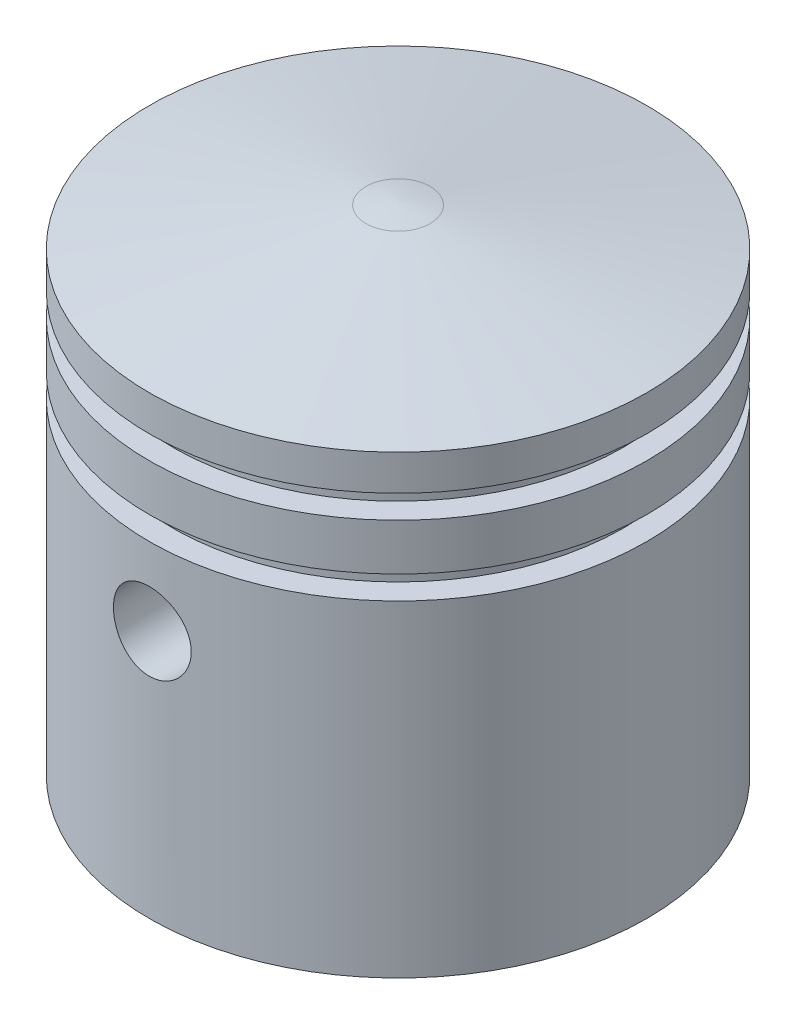
ISO-10303-21;
HEADER;
FILE_DESCRIPTION(('STEP AP214'),'2;1');
FILE_NAME('part.step','',(''),(''),'','','');
FILE_SCHEMA(('AUTOMOTIVE_DESIGN { 1 0 10303 214 1 1 1 1 }'));
ENDSEC;
DATA;
#1=APPLICATION_CONTEXT('core data for automotive mechanical design processes');
#2=APPLICATION_PROTOCOL_DEFINITION('international standard','automotive_design',2000,#1);
#3=PRODUCT_CONTEXT('',#1,'mechanical');
#4=PRODUCT('Part','Part','',(#3));
#5=PRODUCT_RELATED_PRODUCT_CATEGORY('part','',(#4));
#6=PRODUCT_DEFINITION_FORMATION('','',#4);
#7=PRODUCT_DEFINITION_CONTEXT('part definition',#1,'design');
#8=PRODUCT_DEFINITION('design','',#6,#7);
#9=PRODUCT_DEFINITION_SHAPE('','',#8);
#10=(LENGTH_UNIT() NAMED_UNIT(*) SI_UNIT(.MILLI.,.METRE.));
#11=(NAMED_UNIT(*) PLANE_ANGLE_UNIT() SI_UNIT($,.RADIAN.));
#12=(NAMED_UNIT(*) SI_UNIT($,.STERADIAN.) SOLID_ANGLE_UNIT());
#13=UNCERTAINTY_MEASURE_WITH_UNIT(LENGTH_MEASURE(1.E-05),#10,'distance_accuracy_value','');
#14=(GEOMETRIC_REPRESENTATION_CONTEXT(3) GLOBAL_UNCERTAINTY_ASSIGNED_CONTEXT((#13)) GLOBAL_UNIT_ASSIGNED_CONTEXT((#10,
#11,#12)) REPRESENTATION_CONTEXT('',''));
#15=CARTESIAN_POINT('',(0.,0.,0.));
#16=DIRECTION('',(0.,0.,1.));
#17=DIRECTION('',(1.,0.,0.));
#18=AXIS2_PLACEMENT_3D('',#15,#16,#17);
#19=CARTESIAN_POINT('',(0.,29.2889063209804,0.));
#20=DIRECTION('',(0.,-1.,0.));
#21=DIRECTION('',(1.,0.,0.));
#22=AXIS2_PLACEMENT_3D('',#19,#20,#21);
#23=CONICAL_SURFACE('',#22,16.,1.39626340159547);
#24=CARTESIAN_POINT('',(0.,31.7456109480511,0.));
#25=DIRECTION('',(0.,-1.,0.));
#26=DIRECTION('',(1.,0.,0.));
#27=AXIS2_PLACEMENT_3D('',#24,#25,#26);
#28=CIRCLE('',#27,2.06733571232229);
#29=CARTESIAN_POINT('',(2.06733571232227,31.7456109480511,0.));
#30=VERTEX_POINT('',#29);
#31=EDGE_CURVE('E62',#30,#30,#28,.T.);
#32=CARTESIAN_POINT('',(0.,29.2889063209804,0.));
#33=DIRECTION('',(0.,-1.,0.));
#34=DIRECTION('',(1.,0.,0.));
#35=AXIS2_PLACEMENT_3D('',#32,#33,#34);
#36=CIRCLE('',#35,16.);
#37=CARTESIAN_POINT('',(16.,29.2889063209804,0.));
#38=VERTEX_POINT('',#37);
#39=EDGE_CURVE('E125',#38,#38,#36,.T.);
#40=CARTESIAN_POINT('',(2.06733571232227,31.7456109480511,0.));
#41=CARTESIAN_POINT('',(2.21246763198558,31.7200202748525,0.));
#42=CARTESIAN_POINT('',(2.35759955164889,31.6944296016538,0.));
#43=CARTESIAN_POINT('',(2.64786339097551,31.6432482552565,0.));
#44=CARTESIAN_POINT('',(2.79299531063882,31.6176575820579,0.));
#45=CARTESIAN_POINT('',(3.08325914996544,31.5664762356606,0.));
#46=CARTESIAN_POINT('',(3.22839106962875,31.5408855624619,0.));
#47=CARTESIAN_POINT('',(3.51865490895537,31.4897042160646,0.));
#48=CARTESIAN_POINT('',(3.66378682861868,31.464113542866,0.));
#49=CARTESIAN_POINT('',(3.9540506679453,31.4129321964686,0.));
#50=CARTESIAN_POINT('',(4.09918258760861,31.38734152327,0.));
#51=CARTESIAN_POINT('',(4.38944642693523,31.3361601768727,0.));
#52=CARTESIAN_POINT('',(4.53457834659854,31.310569503674,0.));
#53=CARTESIAN_POINT('',(4.82484218592516,31.2593881572767,0.));
#54=CARTESIAN_POINT('',(4.96997410558847,31.2337974840781,0.));
#55=CARTESIAN_POINT('',(5.26023794491509,31.1826161376808,0.));
#56=CARTESIAN_POINT('',(5.4053698645784,31.1570254644821,0.));
#57=CARTESIAN_POINT('',(5.69563370390502,31.1058441180848,0.));
#58=CARTESIAN_POINT('',(5.84076562356833,31.0802534448861,0.));
#59=CARTESIAN_POINT('',(6.13102946289495,31.0290720984888,0.));
#60=CARTESIAN_POINT('',(6.27616138255826,31.0034814252902,0.));
#61=CARTESIAN_POINT('',(6.56642522188487,30.9523000788929,0.));
#62=CARTESIAN_POINT('',(6.71155714154818,30.9267094056942,0.));
#63=CARTESIAN_POINT('',(7.0018209808748,30.8755280592969,0.));
#64=CARTESIAN_POINT('',(7.14695290053811,30.8499373860983,0.));
#65=CARTESIAN_POINT('',(7.43721673986473,30.798756039701,0.));
#66=CARTESIAN_POINT('',(7.58234865952804,30.7731653665023,0.));
#67=CARTESIAN_POINT('',(7.87261249885466,30.721984020105,0.));
#68=CARTESIAN_POINT('',(8.01774441851797,30.6963933469063,0.));
#69=CARTESIAN_POINT('',(8.30800825784459,30.645212000509,0.));
#70=CARTESIAN_POINT('',(8.4531401775079,30.6196213273104,0.));
#71=CARTESIAN_POINT('',(8.74340401683452,30.5684399809131,0.));
#72=CARTESIAN_POINT('',(8.88853593649783,30.5428493077144,0.));
#73=CARTESIAN_POINT('',(9.17879977582445,30.4916679613171,0.));
#74=CARTESIAN_POINT('',(9.32393169548776,30.4660772881185,0.));
#75=CARTESIAN_POINT('',(9.61419553481438,30.4148959417211,0.));
#76=CARTESIAN_POINT('',(9.75932745447769,30.3893052685225,0.));
#77=CARTESIAN_POINT('',(10.0495912938043,30.3381239221252,0.));
#78=CARTESIAN_POINT('',(10.1947232134676,30.3125332489265,0.));
#79=CARTESIAN_POINT('',(10.4849870527942,30.2613519025292,0.));
#80=CARTESIAN_POINT('',(10.6301189724575,30.2357612293306,0.));
#81=CARTESIAN_POINT('',(10.9203828117842,30.1845798829333,0.));
#82=CARTESIAN_POINT('',(11.0655147314475,30.1589892097346,0.));
#83=CARTESIAN_POINT('',(11.3557785707741,30.1078078633373,0.));
#84=CARTESIAN_POINT('',(11.5009104904374,30.0822171901386,0.));
#85=CARTESIAN_POINT('',(11.791174329764,30.0310358437413,0.));
#86=CARTESIAN_POINT('',(11.9363062494273,30.0054451705427,0.));
#87=CARTESIAN_POINT('',(12.226570088754,29.9542638241454,0.));
#88=CARTESIAN_POINT('',(12.3717020084173,29.9286731509467,0.));
#89=CARTESIAN_POINT('',(12.6619658477439,29.8774918045494,0.));
#90=CARTESIAN_POINT('',(12.8070977674072,29.8519011313508,0.));
#91=CARTESIAN_POINT('',(13.0973616067338,29.8007197849535,0.));
#92=CARTESIAN_POINT('',(13.2424935263971,29.7751291117548,0.));
#93=CARTESIAN_POINT('',(13.5327573657237,29.7239477653575,0.));
#94=CARTESIAN_POINT('',(13.6778892853871,29.6983570921588,0.));
#95=CARTESIAN_POINT('',(13.9681531247137,29.6471757457615,0.));
#96=CARTESIAN_POINT('',(14.113285044377,29.6215850725629,0.));
#97=CARTESIAN_POINT('',(14.4035488837036,29.5704037261656,0.));
#98=CARTESIAN_POINT('',(14.5486808033669,29.5448130529669,0.));
#99=CARTESIAN_POINT('',(14.8389446426935,29.4936317065696,0.));
#100=CARTESIAN_POINT('',(14.9840765623568,29.468041033371,0.));
#101=CARTESIAN_POINT('',(15.2743404016835,29.4168596869736,0.));
#102=CARTESIAN_POINT('',(15.4194723213468,29.391269013775,0.));
#103=CARTESIAN_POINT('',(15.7097361606734,29.3400876673777,0.));
#104=CARTESIAN_POINT('',(15.8548680803367,29.314496994179,0.));
#105=CARTESIAN_POINT('',(16.,29.2889063209804,0.));
#106=B_SPLINE_CURVE_WITH_KNOTS('',3,(#40,#41,#42,#43,#44,#45,#46,#47,#48,#49,#50,#51,#52,#53,
#54,#55,#56,#57,#58,#59,#60,#61,#62,#63,#64,#65,#66,#67,#68,#69,#70,#71,#72,#73,#74,#75,#76,#77,
#78,#79,#80,#81,#82,#83,#84,#85,#86,#87,#88,#89,#90,#91,#92,#93,#94,#95,#96,#97,#98,#99,#100,
#101,#102,#103,#104,#105),.UNSPECIFIED.,.F.,.F.,(4,2,2,2,2,2,2,2,2,2,2,2,2,2,2,2,2,2,2,2,2,2,2,
2,2,2,2,2,2,2,2,2,4),(0.,0.442112440380564,0.88422488076113,1.3263373211417,1.76844976152226,
2.21056220190283,2.65267464228339,3.09478708266396,3.53689952304453,3.97901196342509,
4.42112440380566,4.86323684418622,5.30534928456679,5.74746172494735,6.18957416532792,
6.63168660570848,7.07379904608905,7.51591148646962,7.95802392685018,8.40013636723075,
8.84224880761131,9.28436124799188,9.72647368837244,10.168586128753,10.6106985691336,
11.0528110095141,11.4949234498947,11.9370358902753,12.3791483306558,12.8212607710364,
13.263373211417,13.7054856517975,14.1475980921781),.UNSPECIFIED.);
#107=EDGE_CURVE('BSEAM41',#30,#38,#106,.T.);
#108=ORIENTED_EDGE('',*,*,#31,.T.);
#109=ORIENTED_EDGE('',*,*,#39,.F.);
#110=ORIENTED_EDGE('',*,*,#107,.T.);
#111=ORIENTED_EDGE('',*,*,#107,.F.);
#112=EDGE_LOOP('',(#108,#110,#109,#111));
#113=FACE_BOUND('',#112,.T.);
#114=ADVANCED_FACE('F41',(#113),#23,.T.);
#115=CARTESIAN_POINT('',(-1.40562784101618,12.049455887807,0.));
#116=DIRECTION('',(0.,0.,-1.));
#117=DIRECTION('',(1.,0.,0.));
#118=AXIS2_PLACEMENT_3D('',#115,#116,#117);
#119=CIRCLE('',#118,20.);
#120=TRIMMED_CURVE('',#119,(PARAMETER_VALUE(-1.5004569469059)),
(PARAMETER_VALUE(1.5004569469059)),.T.,.PARAMETER.);
#121=CARTESIAN_POINT('',(0.,12.049455887807,0.));
#122=DIRECTION('',(0.,-1.,0.));
#123=AXIS1_PLACEMENT('',#121,#122);
#124=SURFACE_OF_REVOLUTION('',#120,#123);
#125=CARTESIAN_POINT('',(0.,32.,0.));
#126=VERTEX_POINT('',#125);
#127=VERTEX_LOOP('',#126);
#128=FACE_BOUND('',#127,.T.);
#129=ORIENTED_EDGE('',*,*,#31,.F.);
#130=EDGE_LOOP('',(#129));
#131=FACE_BOUND('',#130,.T.);
#132=ADVANCED_FACE('F56',(#128,#131),#124,.T.);
#133=CARTESIAN_POINT('',(10.,24.,0.));
#134=DIRECTION('',(0.,-1.,0.));
#135=DIRECTION('',(1.,0.,0.));
#136=AXIS2_PLACEMENT_3D('',#133,#134,#135);
#137=PLANE('',#136);
#138=CARTESIAN_POINT('',(0.,24.,0.));
#139=DIRECTION('',(0.,-1.,0.));
#140=DIRECTION('',(1.,0.,0.));
#141=AXIS2_PLACEMENT_3D('',#138,#139,#140);
#142=CIRCLE('',#141,10.);
#143=CARTESIAN_POINT('',(10.,24.,0.));
#144=VERTEX_POINT('',#143);
#145=EDGE_CURVE('E65',#144,#144,#142,.T.);
#146=ORIENTED_EDGE('',*,*,#145,.T.);
#147=EDGE_LOOP('',(#146));
#148=FACE_BOUND('',#147,.T.);
#149=ADVANCED_FACE('F59',(#148),#137,.T.);
#150=CARTESIAN_POINT('',(0.,0.,0.));
#151=DIRECTION('',(0.,-1.,0.));
#152=DIRECTION('',(1.,0.,0.));
#153=AXIS2_PLACEMENT_3D('',#150,#151,#152);
#154=CYLINDRICAL_SURFACE('',#153,10.);
#155=CARTESIAN_POINT('',(2.5,16.,-9.68245836551854));
#156=CARTESIAN_POINT('',(2.49999607859307,16.1380507509266,-9.6824610008786));
#157=CARTESIAN_POINT('',(2.48852624549765,16.2761448986785,-9.68544306014597));
#158=CARTESIAN_POINT('',(2.44302312546379,16.5483675781735,-9.69701861992564));
#159=CARTESIAN_POINT('',(2.4089767067421,16.6824937544682,-9.7056153862163));
#160=CARTESIAN_POINT('',(2.31949119963204,16.9428035381872,-9.7273872459615));
#161=CARTESIAN_POINT('',(2.26407972785449,17.0689971553857,-9.74055642690458));
#162=CARTESIAN_POINT('',(2.13352114126138,17.3103108525399,-9.76998192028759));
#163=CARTESIAN_POINT('',(2.05837318856069,17.4254304620802,-9.78623836378489));
#164=CARTESIAN_POINT('',(1.88870842731188,17.6438616452622,-9.82040716355625));
#165=CARTESIAN_POINT('',(1.79383688770405,17.74689360035,-9.83834597623034));
#166=CARTESIAN_POINT('',(1.58818206410066,17.9357613943603,-9.87362875515294));
#167=CARTESIAN_POINT('',(1.47739729418031,18.0215956256217,-9.89097266566388));
#168=CARTESIAN_POINT('',(1.24114520107896,18.1747754676313,-9.92340415520583));
#169=CARTESIAN_POINT('',(1.11549457619512,18.2418463881615,-9.93845687400593));
#170=CARTESIAN_POINT('',(0.854263184292764,18.3538096441531,-9.96430811925984));
#171=CARTESIAN_POINT('',(0.718683885791941,18.3987052519155,-9.97510727334345));
#172=CARTESIAN_POINT('',(0.444358758754161,18.4641478345786,-9.9910475884818));
#173=CARTESIAN_POINT('',(0.305732719548976,18.4851696443266,-9.99629893844314));
#174=CARTESIAN_POINT('',(0.02682881926277,18.5037583792756,-10.000935941073));
#175=CARTESIAN_POINT('',(-0.113448794538068,18.5013287722096,-10.000322460967));
#176=CARTESIAN_POINT('',(-0.388380617930967,18.4734251497499,-9.99338094953534));
#177=CARTESIAN_POINT('',(-0.523090539002667,18.4484636749461,-9.98718002340871));
#178=CARTESIAN_POINT('',(-0.786345618534214,18.3770287299515,-9.96990836524857));
#179=CARTESIAN_POINT('',(-0.914890448426093,18.3305541146226,-9.95883737398452));
#180=CARTESIAN_POINT('',(-1.16351675875451,18.2169974293129,-9.93287509700884));
#181=CARTESIAN_POINT('',(-1.28351127441626,18.1497329553383,-9.91795019695011));
#182=CARTESIAN_POINT('',(-1.51068905585122,17.9966443208837,-9.88589903809692));
#183=CARTESIAN_POINT('',(-1.61787008771376,17.9108169314394,-9.8687723965265));
#184=CARTESIAN_POINT('',(-1.81943508771239,17.7202912580176,-9.83363713769356));
#185=CARTESIAN_POINT('',(-1.91339419768799,17.6151451076523,-9.81561719525298));
#186=CARTESIAN_POINT('',(-2.08244093990755,17.3904000264597,-9.78115043517328));
#187=CARTESIAN_POINT('',(-2.15752769011507,17.2708004205089,-9.76470369108289));
#188=CARTESIAN_POINT('',(-2.28697032255647,17.0197099658511,-9.73520496829319));
#189=CARTESIAN_POINT('',(-2.34122391742612,16.8881642696872,-9.72216983717007));
#190=CARTESIAN_POINT('',(-2.42671405159095,16.6174145319232,-9.70118640148669));
#191=CARTESIAN_POINT('',(-2.45795551638266,16.4782121360154,-9.69323700842733));
#192=CARTESIAN_POINT('',(-2.49582963866592,16.2000404984701,-9.68355356007457));
#193=CARTESIAN_POINT('',(-2.50309047391912,16.061162206659,-9.68166088976934));
#194=CARTESIAN_POINT('',(-2.49451699051516,15.7841780634147,-9.68387343364692));
#195=CARTESIAN_POINT('',(-2.4786847978498,15.6460721420506,-9.68797809570301));
#196=CARTESIAN_POINT('',(-2.42492546393825,15.3768857350514,-9.7015708198498));
#197=CARTESIAN_POINT('',(-2.3873640682819,15.2457272734308,-9.71096970242532));
#198=CARTESIAN_POINT('',(-2.29161808167046,14.9915685421467,-9.73400718262805));
#199=CARTESIAN_POINT('',(-2.2334310477125,14.8685692409442,-9.74764628246408));
#200=CARTESIAN_POINT('',(-2.0967706679366,14.6315587221331,-9.77796137095511));
#201=CARTESIAN_POINT('',(-2.01792175383564,14.517771159957,-9.79469168607245));
#202=CARTESIAN_POINT('',(-1.84265073233613,14.3048116371985,-9.82917083071113));
#203=CARTESIAN_POINT('',(-1.7462257370136,14.2056420833499,-9.84691982728307));
#204=CARTESIAN_POINT('',(-1.53565680246182,14.0221889574291,-9.88197403031774));
#205=CARTESIAN_POINT('',(-1.42112988132898,13.9383399374512,-9.8992570206188));
#206=CARTESIAN_POINT('',(-1.17925670673669,13.7910641330487,-9.9309721661369));
#207=CARTESIAN_POINT('',(-1.05191112239398,13.7276362833918,-9.9454044700395));
#208=CARTESIAN_POINT('',(-0.788895504327727,13.6235539654721,-9.96970115738325));
#209=CARTESIAN_POINT('',(-0.653293452569706,13.5827357156209,-9.9795983002241));
#210=CARTESIAN_POINT('',(-0.376874400797018,13.5245396653916,-9.99385293395789));
#211=CARTESIAN_POINT('',(-0.236058412603102,13.507157341261,-9.99821149393422));
#212=CARTESIAN_POINT('',(0.0427088161083075,13.4965810260612,-10.0008542352202));
#213=CARTESIAN_POINT('',(0.180634567415054,13.5027457272615,-9.99929947199971));
#214=CARTESIAN_POINT('',(0.453418741036877,13.5376195682359,-9.99064741143609));
#215=CARTESIAN_POINT('',(0.588277254452321,13.5663280375329,-9.98355027892923));
#216=CARTESIAN_POINT('',(0.850427589111935,13.6451305494272,-9.96463582134723));
#217=CARTESIAN_POINT('',(0.977756236452157,13.6951086332859,-9.95284411255981));
#218=CARTESIAN_POINT('',(1.22229263260406,13.8149264475489,-9.92578222284145));
#219=CARTESIAN_POINT('',(1.33949910316408,13.8847686816762,-9.91051160346894));
#220=CARTESIAN_POINT('',(1.56350482105826,14.0442880849903,-9.87768124200718));
#221=CARTESIAN_POINT('',(1.66998747074584,14.1344003572596,-9.86007542354161));
#222=CARTESIAN_POINT('',(1.86653755068376,14.3310571299434,-9.82476622642974));
#223=CARTESIAN_POINT('',(1.95660081269147,14.4376057902779,-9.80706282418256));
#224=CARTESIAN_POINT('',(2.11940506617958,14.6665035354736,-9.77318689613756));
#225=CARTESIAN_POINT('',(2.19179154854095,14.7891103084131,-9.75704909183222));
#226=CARTESIAN_POINT('',(2.31481724146367,15.045138724687,-9.7285988873707));
#227=CARTESIAN_POINT('',(2.36547227438038,15.1785524152346,-9.71628370583034));
#228=CARTESIAN_POINT('',(2.43605632142751,15.4264425295879,-9.69879771876843));
#229=CARTESIAN_POINT('',(2.4599829264922,15.5397329109653,-9.69271657508747));
#230=CARTESIAN_POINT('',(2.49195573142942,15.7686721724942,-9.6845459645655));
#231=CARTESIAN_POINT('',(2.50000328592938,15.884320850611,-9.6824561572277));
#232=CARTESIAN_POINT('',(2.5,16.,-9.68245836551854));
#233=B_SPLINE_CURVE_WITH_KNOTS('',3,(#155,#156,#157,#158,#159,#160,#161,#162,#163,#164,#165,
#166,#167,#168,#169,#170,#171,#172,#173,#174,#175,#176,#177,#178,#179,#180,#181,#182,#183,#184,
#185,#186,#187,#188,#189,#190,#191,#192,#193,#194,#195,#196,#197,#198,#199,#200,#201,#202,#203,
#204,#205,#206,#207,#208,#209,#210,#211,#212,#213,#214,#215,#216,#217,#218,#219,#220,#221,#222,
#223,#224,#225,#226,#227,#228,#229,#230,#231,#232),.UNSPECIFIED.,.T.,.F.,(4,2,2,2,2,2,2,2,2,2,2,
2,2,2,2,2,2,2,2,2,2,2,2,2,2,2,2,2,2,2,2,2,2,2,2,2,2,2,4),(0.,0.413727441736142,
0.827695741428666,1.24113072716602,1.65458326755478,2.07623954192976,2.49793521479867,
2.9255149639792,3.35303159847092,3.77188750995347,4.1906814866602,4.60018262688947,
5.00970556724786,5.42292874254444,5.83622385468913,6.26070466571911,6.68520531199802,
7.11176432008402,7.53823200129548,7.95343574764204,8.36860127188747,8.77697405014152,
9.18539521426363,9.60182845864102,10.0183301888999,10.4452533097026,10.872154157245,
11.2959207281187,11.7196054891398,12.131834461324,12.5440511738193,12.9540487656466,
13.3640980574302,13.7839709658702,14.2039503157045,14.6317647729113,15.0592672137501,
15.4059782718572,15.7526597510792),.UNSPECIFIED.);
#234=CARTESIAN_POINT('',(2.5,16.,-9.68245836551854));
#235=VERTEX_POINT('',#234);
#236=EDGE_CURVE('E101',#235,#235,#233,.T.);
#237=ORIENTED_EDGE('',*,*,#236,.F.);
#238=EDGE_LOOP('',(#237));
#239=FACE_BOUND('',#238,.T.);
#240=CARTESIAN_POINT('',(2.5,16.,9.68245836551854));
#241=CARTESIAN_POINT('',(2.49999607859307,15.8619492490734,9.6824610008786));
#242=CARTESIAN_POINT('',(2.48852624549765,15.7238551013215,9.68544306014597));
#243=CARTESIAN_POINT('',(2.44302312546379,15.4516324218265,9.69701861992564));
#244=CARTESIAN_POINT('',(2.4089767067421,15.3175062455318,9.7056153862163));
#245=CARTESIAN_POINT('',(2.31949119963204,15.0571964618128,9.7273872459615));
#246=CARTESIAN_POINT('',(2.26407972785449,14.9310028446143,9.74055642690458));
#247=CARTESIAN_POINT('',(2.13352114126138,14.6896891474601,9.76998192028759));
#248=CARTESIAN_POINT('',(2.05837318856068,14.5745695379198,9.78623836378489));
#249=CARTESIAN_POINT('',(1.88870842731188,14.3561383547378,9.82040716355625));
#250=CARTESIAN_POINT('',(1.79383688770405,14.25310639965,9.83834597623034));
#251=CARTESIAN_POINT('',(1.58818206410066,14.0642386056397,9.87362875515294));
#252=CARTESIAN_POINT('',(1.47739729418031,13.9784043743783,9.89097266566388));
#253=CARTESIAN_POINT('',(1.24114520107895,13.8252245323687,9.92340415520583));
#254=CARTESIAN_POINT('',(1.11549457619512,13.7581536118385,9.93845687400593));
#255=CARTESIAN_POINT('',(0.854263184292762,13.6461903558469,9.96430811925984));
#256=CARTESIAN_POINT('',(0.71868388579194,13.6012947480845,9.97510727334345));
#257=CARTESIAN_POINT('',(0.444358758754161,13.5358521654214,9.9910475884818));
#258=CARTESIAN_POINT('',(0.305732719548975,13.5148303556734,9.99629893844314));
#259=CARTESIAN_POINT('',(0.0268288192627686,13.4962416207244,10.000935941073));
#260=CARTESIAN_POINT('',(-0.113448794538069,13.4986712277904,10.000322460967));
#261=CARTESIAN_POINT('',(-0.388380617930969,13.5265748502501,9.99338094953534));
#262=CARTESIAN_POINT('',(-0.523090539002668,13.5515363250539,9.98718002340871));
#263=CARTESIAN_POINT('',(-0.786345618534216,13.6229712700485,9.96990836524857));
#264=CARTESIAN_POINT('',(-0.914890448426096,13.6694458853774,9.95883737398452));
#265=CARTESIAN_POINT('',(-1.16351675875452,13.7830025706871,9.93287509700884));
#266=CARTESIAN_POINT('',(-1.28351127441626,13.8502670446617,9.91795019695011));
#267=CARTESIAN_POINT('',(-1.51068905585122,14.0033556791163,9.88589903809692));
#268=CARTESIAN_POINT('',(-1.61787008771377,14.0891830685606,9.8687723965265));
#269=CARTESIAN_POINT('',(-1.81943508771239,14.2797087419824,9.83363713769356));
#270=CARTESIAN_POINT('',(-1.91339419768799,14.3848548923477,9.81561719525297));
#271=CARTESIAN_POINT('',(-2.08244093990755,14.6095999735403,9.78115043517327));
#272=CARTESIAN_POINT('',(-2.15752769011507,14.7291995794911,9.76470369108289));
#273=CARTESIAN_POINT('',(-2.28697032255647,14.9802900341489,9.73520496829319));
#274=CARTESIAN_POINT('',(-2.34122391742612,15.1118357303128,9.72216983717007));
#275=CARTESIAN_POINT('',(-2.42671405159095,15.3825854680768,9.70118640148669));
#276=CARTESIAN_POINT('',(-2.45795551638266,15.5217878639846,9.69323700842733));
#277=CARTESIAN_POINT('',(-2.49582963866592,15.7999595015299,9.68355356007457));
#278=CARTESIAN_POINT('',(-2.50309047391912,15.938837793341,9.68166088976934));
#279=CARTESIAN_POINT('',(-2.49451699051516,16.2158219365853,9.68387343364692));
#280=CARTESIAN_POINT('',(-2.4786847978498,16.3539278579494,9.68797809570301));
#281=CARTESIAN_POINT('',(-2.42492546393825,16.6231142649486,9.7015708198498));
#282=CARTESIAN_POINT('',(-2.3873640682819,16.7542727265692,9.71096970242532));
#283=CARTESIAN_POINT('',(-2.29161808167046,17.0084314578533,9.73400718262805));
#284=CARTESIAN_POINT('',(-2.2334310477125,17.1314307590558,9.74764628246408));
#285=CARTESIAN_POINT('',(-2.0967706679366,17.3684412778669,9.77796137095511));
#286=CARTESIAN_POINT('',(-2.01792175383564,17.482228840043,9.79469168607245));
#287=CARTESIAN_POINT('',(-1.84265073233613,17.6951883628015,9.82917083071113));
#288=CARTESIAN_POINT('',(-1.74622573701359,17.7943579166501,9.84691982728307));
#289=CARTESIAN_POINT('',(-1.53565680246182,17.9778110425709,9.88197403031774));
#290=CARTESIAN_POINT('',(-1.42112988132898,18.0616600625488,9.8992570206188));
#291=CARTESIAN_POINT('',(-1.17925670673669,18.2089358669513,9.9309721661369));
#292=CARTESIAN_POINT('',(-1.05191112239398,18.2723637166082,9.9454044700395));
#293=CARTESIAN_POINT('',(-0.788895504327725,18.3764460345279,9.96970115738325));
#294=CARTESIAN_POINT('',(-0.653293452569705,18.4172642843791,9.9795983002241));
#295=CARTESIAN_POINT('',(-0.376874400797017,18.4754603346084,9.99385293395789));
#296=CARTESIAN_POINT('',(-0.236058412603101,18.492842658739,9.99821149393422));
#297=CARTESIAN_POINT('',(0.0427088161083082,18.5034189739388,10.0008542352202));
#298=CARTESIAN_POINT('',(0.180634567415055,18.4972542727385,9.99929947199971));
#299=CARTESIAN_POINT('',(0.453418741036878,18.4623804317641,9.99064741143609));
#300=CARTESIAN_POINT('',(0.588277254452322,18.4336719624671,9.98355027892923));
#301=CARTESIAN_POINT('',(0.850427589111936,18.3548694505728,9.96463582134723));
#302=CARTESIAN_POINT('',(0.977756236452158,18.3048913667141,9.95284411255981));
#303=CARTESIAN_POINT('',(1.22229263260406,18.1850735524511,9.92578222284145));
#304=CARTESIAN_POINT('',(1.33949910316408,18.1152313183238,9.91051160346894));
#305=CARTESIAN_POINT('',(1.56350482105826,17.9557119150097,9.87768124200718));
#306=CARTESIAN_POINT('',(1.66998747074584,17.8655996427404,9.86007542354161));
#307=CARTESIAN_POINT('',(1.86653755068376,17.6689428700566,9.82476622642974));
#308=CARTESIAN_POINT('',(1.95660081269148,17.5623942097221,9.80706282418256));
#309=CARTESIAN_POINT('',(2.11940506617958,17.3334964645263,9.77318689613756));
#310=CARTESIAN_POINT('',(2.19179154854095,17.2108896915869,9.75704909183222));
#311=CARTESIAN_POINT('',(2.31481724146367,16.954861275313,9.7285988873707));
#312=CARTESIAN_POINT('',(2.36547227438038,16.8214475847654,9.71628370583034));
#313=CARTESIAN_POINT('',(2.43605632142751,16.5735574704121,9.69879771876843));
#314=CARTESIAN_POINT('',(2.4599829264922,16.4602670890347,9.69271657508747));
#315=CARTESIAN_POINT('',(2.49195573142942,16.2313278275058,9.6845459645655));
#316=CARTESIAN_POINT('',(2.50000328592938,16.115679149389,9.6824561572277));
#317=CARTESIAN_POINT('',(2.5,16.,9.68245836551854));
#318=B_SPLINE_CURVE_WITH_KNOTS('',3,(#240,#241,#242,#243,#244,#245,#246,#247,#248,#249,#250,
#251,#252,#253,#254,#255,#256,#257,#258,#259,#260,#261,#262,#263,#264,#265,#266,#267,#268,#269,
#270,#271,#272,#273,#274,#275,#276,#277,#278,#279,#280,#281,#282,#283,#284,#285,#286,#287,#288,
#289,#290,#291,#292,#293,#294,#295,#296,#297,#298,#299,#300,#301,#302,#303,#304,#305,#306,#307,
#308,#309,#310,#311,#312,#313,#314,#315,#316,#317),.UNSPECIFIED.,.T.,.F.,(4,2,2,2,2,2,2,2,2,2,2,
2,2,2,2,2,2,2,2,2,2,2,2,2,2,2,2,2,2,2,2,2,2,2,2,2,2,2,4),(0.,0.413727441736135,
0.827695741428666,1.24113072716602,1.65458326755479,2.07623954192976,2.49793521479867,
2.9255149639792,3.35303159847092,3.77188750995347,4.19068148666021,4.60018262688947,
5.00970556724786,5.42292874254445,5.83622385468913,6.26070466571912,6.68520531199802,
7.11176432008403,7.53823200129548,7.95343574764204,8.36860127188747,8.77697405014152,
9.18539521426363,9.60182845864102,10.0183301888999,10.4452533097026,10.872154157245,
11.2959207281187,11.7196054891398,12.131834461324,12.5440511738193,12.9540487656466,
13.3640980574302,13.7839709658702,14.2039503157045,14.6317647729113,15.0592672137501,
15.4059782718573,15.7526597510792),.UNSPECIFIED.);
#319=CARTESIAN_POINT('',(2.5,16.,9.68245836551854));
#320=VERTEX_POINT('',#319);
#321=EDGE_CURVE('E94',#320,#320,#318,.T.);
#322=ORIENTED_EDGE('',*,*,#321,.F.);
#323=EDGE_LOOP('',(#322));
#324=FACE_BOUND('',#323,.T.);
#325=CARTESIAN_POINT('',(0.,10.,0.));
#326=DIRECTION('',(0.,-1.,0.));
#327=DIRECTION('',(1.,0.,0.));
#328=AXIS2_PLACEMENT_3D('',#325,#326,#327);
#329=CIRCLE('',#328,10.);
#330=CARTESIAN_POINT('',(10.,10.,0.));
#331=VERTEX_POINT('',#330);
#332=EDGE_CURVE('E71',#331,#331,#329,.T.);
#333=ORIENTED_EDGE('',*,*,#332,.T.);
#334=EDGE_LOOP('',(#333));
#335=FACE_BOUND('',#334,.T.);
#336=ORIENTED_EDGE('',*,*,#145,.F.);
#337=EDGE_LOOP('',(#336));
#338=FACE_BOUND('',#337,.T.);
#339=ADVANCED_FACE('F106',(#239,#324,#335,#338),#154,.F.);
#340=CARTESIAN_POINT('',(13.,10.,0.));
#341=DIRECTION('',(0.,-1.,0.));
#342=DIRECTION('',(1.,0.,0.));
#343=AXIS2_PLACEMENT_3D('',#340,#341,#342);
#344=PLANE('',#343);
#345=CARTESIAN_POINT('',(0.,10.,0.));
#346=DIRECTION('',(0.,-1.,0.));
#347=DIRECTION('',(1.,0.,0.));
#348=AXIS2_PLACEMENT_3D('',#345,#346,#347);
#349=CIRCLE('',#348,13.);
#350=CARTESIAN_POINT('',(13.,10.,0.));
#351=VERTEX_POINT('',#350);
#352=EDGE_CURVE('E171',#351,#351,#349,.T.);
#353=ORIENTED_EDGE('',*,*,#352,.T.);
#354=EDGE_LOOP('',(#353));
#355=FACE_BOUND('',#354,.T.);
#356=ORIENTED_EDGE('',*,*,#332,.F.);
#357=EDGE_LOOP('',(#356));
#358=FACE_BOUND('',#357,.T.);
#359=ADVANCED_FACE('F111',(#355,#358),#344,.T.);
#360=CARTESIAN_POINT('',(0.,0.,0.));
#361=DIRECTION('',(0.,-1.,0.));
#362=DIRECTION('',(1.,0.,0.));
#363=AXIS2_PLACEMENT_3D('',#360,#361,#362);
#364=CYLINDRICAL_SURFACE('',#363,13.);
#365=CARTESIAN_POINT('',(0.,0.,0.));
#366=DIRECTION('',(0.,-1.,0.));
#367=DIRECTION('',(1.,0.,0.));
#368=AXIS2_PLACEMENT_3D('',#365,#366,#367);
#369=CIRCLE('',#368,13.);
#370=CARTESIAN_POINT('',(13.,0.,0.));
#371=VERTEX_POINT('',#370);
#372=EDGE_CURVE('E167',#371,#371,#369,.T.);
#373=ORIENTED_EDGE('',*,*,#372,.T.);
#374=EDGE_LOOP('',(#373));
#375=FACE_BOUND('',#374,.T.);
#376=ORIENTED_EDGE('',*,*,#352,.F.);
#377=EDGE_LOOP('',(#376));
#378=FACE_BOUND('',#377,.T.);
#379=ADVANCED_FACE('F181',(#375,#378),#364,.F.);
#380=CARTESIAN_POINT('',(16.,0.,0.));
#381=DIRECTION('',(0.,-1.,0.));
#382=DIRECTION('',(1.,0.,0.));
#383=AXIS2_PLACEMENT_3D('',#380,#381,#382);
#384=PLANE('',#383);
#385=CARTESIAN_POINT('',(0.,0.,0.));
#386=DIRECTION('',(0.,-1.,0.));
#387=DIRECTION('',(1.,0.,0.));
#388=AXIS2_PLACEMENT_3D('',#385,#386,#387);
#389=CIRCLE('',#388,16.);
#390=CARTESIAN_POINT('',(16.,0.,0.));
#391=VERTEX_POINT('',#390);
#392=EDGE_CURVE('E163',#391,#391,#389,.T.);
#393=ORIENTED_EDGE('',*,*,#392,.T.);
#394=EDGE_LOOP('',(#393));
#395=FACE_BOUND('',#394,.T.);
#396=ORIENTED_EDGE('',*,*,#372,.F.);
#397=EDGE_LOOP('',(#396));
#398=FACE_BOUND('',#397,.T.);
#399=ADVANCED_FACE('F186',(#395,#398),#384,.T.);
#400=CARTESIAN_POINT('',(0.,0.,0.));
#401=DIRECTION('',(0.,-1.,0.));
#402=DIRECTION('',(1.,0.,0.));
#403=AXIS2_PLACEMENT_3D('',#400,#401,#402);
#404=CYLINDRICAL_SURFACE('',#403,16.);
#405=CARTESIAN_POINT('',(0.,13.5,-16.));
#406=CARTESIAN_POINT('',(-0.139515097271034,13.5000056982715,-15.9999977019448));
#407=CARTESIAN_POINT('',(-0.279109404865705,13.5117181137736,-15.9981561248574));
#408=CARTESIAN_POINT('',(-0.554391314978103,13.5582436912768,-15.9909869809759));
#409=CARTESIAN_POINT('',(-0.690075061323318,13.5930788925035,-15.9856560884472));
#410=CARTESIAN_POINT('',(-0.953512538047404,13.6847796628066,-15.9721069716578));
#411=CARTESIAN_POINT('',(-1.0812723522899,13.7416280813616,-15.9638909956317));
#412=CARTESIAN_POINT('',(-1.3254212510446,13.8756985451416,-15.9454779403816));
#413=CARTESIAN_POINT('',(-1.44181181036831,13.9529179430359,-15.9352811186255));
#414=CARTESIAN_POINT('',(-1.66091991165162,14.126233048354,-15.9139426841436));
#415=CARTESIAN_POINT('',(-1.76352747914264,14.2224669948903,-15.9027945139234));
#416=CARTESIAN_POINT('',(-1.95120768822823,14.4307819482689,-15.8808607613029));
#417=CARTESIAN_POINT('',(-2.03627928654192,14.5428638973002,-15.8700752005075));
#418=CARTESIAN_POINT('',(-2.18690544328884,14.7804382713437,-15.8500242812745));
#419=CARTESIAN_POINT('',(-2.25235273557992,14.9059994823618,-15.840767397861));
#420=CARTESIAN_POINT('',(-2.36118681597065,15.1665014108578,-15.8249120174237));
#421=CARTESIAN_POINT('',(-2.40457491010063,15.3014415725106,-15.8183133630222));
#422=CARTESIAN_POINT('',(-2.46771559322167,15.5757109011438,-15.8085863451104));
#423=CARTESIAN_POINT('',(-2.48765705487496,15.7149955858188,-15.8054302653236));
#424=CARTESIAN_POINT('',(-2.50392369757621,15.9949671888926,-15.8028617107177));
#425=CARTESIAN_POINT('',(-2.50025034860466,16.135654019466,-15.8034490028802));
#426=CARTESIAN_POINT('',(-2.4695458080889,16.4130970318527,-15.8082755045521));
#427=CARTESIAN_POINT('',(-2.44272562959693,16.5498772233531,-15.8124817218495));
#428=CARTESIAN_POINT('',(-2.36681937833751,16.8169720063593,-15.8240205634547));
#429=CARTESIAN_POINT('',(-2.31773262684132,16.9472864006405,-15.8313532830641));
#430=CARTESIAN_POINT('',(-2.19846916949384,17.1983887126772,-15.8483550685462));
#431=CARTESIAN_POINT('',(-2.12820372315549,17.3191337917731,-15.8580339308724));
#432=CARTESIAN_POINT('',(-1.96864058146637,17.5471995356855,-15.878630461501));
#433=CARTESIAN_POINT('',(-1.87934153253017,17.6545192448875,-15.8895482178821));
#434=CARTESIAN_POINT('',(-1.68309088822333,17.8539102466333,-15.911537862489));
#435=CARTESIAN_POINT('',(-1.57595800560539,17.9458031582695,-15.9226101363559));
#436=CARTESIAN_POINT('',(-1.34769694737936,18.1103331456399,-15.9435512534783));
#437=CARTESIAN_POINT('',(-1.22656870068132,18.1829701235568,-15.9534200906202));
#438=CARTESIAN_POINT('',(-0.973595927056489,18.3069380734224,-15.9708539902704));
#439=CARTESIAN_POINT('',(-0.841744186240458,18.358254558533,-15.9784174854193));
#440=CARTESIAN_POINT('',(-0.571149534696757,18.4379659674472,-15.9903756000068));
#441=CARTESIAN_POINT('',(-0.432407130687198,18.4663625740665,-15.9947704520898));
#442=CARTESIAN_POINT('',(-0.153508336763733,18.4991892764502,-15.9998651172728));
#443=CARTESIAN_POINT('',(-0.0133814615087004,18.5038644789762,-16.0006027179286));
#444=CARTESIAN_POINT('',(0.265654546411643,18.489767294664,-15.9984028649127));
#445=CARTESIAN_POINT('',(0.404563719925157,18.4709956974109,-15.9954655349964));
#446=CARTESIAN_POINT('',(0.676473446265705,18.4107416123198,-15.9862692369322));
#447=CARTESIAN_POINT('',(0.809501262056041,18.3693792417323,-15.9800278421539));
#448=CARTESIAN_POINT('',(1.06673406785663,18.2652449056012,-15.9649207568356));
#449=CARTESIAN_POINT('',(1.19093861303941,18.2024718615573,-15.9560549341007));
#450=CARTESIAN_POINT('',(1.42807220225041,18.0567280088734,-15.9365897274094));
#451=CARTESIAN_POINT('',(1.54090512378372,17.9736025799095,-15.9259772866342));
#452=CARTESIAN_POINT('',(1.75110696507806,17.7897279140922,-15.9042388046444));
#453=CARTESIAN_POINT('',(1.84847490447018,17.6889775607951,-15.8931127309268));
#454=CARTESIAN_POINT('',(2.02588080776691,17.4716188027828,-15.8714802753665));
#455=CARTESIAN_POINT('',(2.10575398584126,17.3548751528777,-15.860980411908));
#456=CARTESIAN_POINT('',(2.2447556772664,17.1094839263387,-15.8419069280583));
#457=CARTESIAN_POINT('',(2.30388478778105,16.9808366925105,-15.83333325222));
#458=CARTESIAN_POINT('',(2.39946771944995,16.7157703592858,-15.8191307135236));
#459=CARTESIAN_POINT('',(2.43600654947912,16.5793825312344,-15.8134908234896));
#460=CARTESIAN_POINT('',(2.48564122040535,16.302310856336,-15.8057657028079));
#461=CARTESIAN_POINT('',(2.49873883084997,16.161627334581,-15.8036802038444));
#462=CARTESIAN_POINT('',(2.50107452690756,15.8816012840925,-15.8033105804488));
#463=CARTESIAN_POINT('',(2.49057180548425,15.7422609030665,-15.804985160429));
#464=CARTESIAN_POINT('',(2.44656223255901,15.4673547028557,-15.8118569894183));
#465=CARTESIAN_POINT('',(2.41305543086961,15.3317888754983,-15.8170542307995));
#466=CARTESIAN_POINT('',(2.32408329891851,15.0683621733595,-15.8303708885491));
#467=CARTESIAN_POINT('',(2.26863761738581,14.9404945217416,-15.8384876895341));
#468=CARTESIAN_POINT('',(2.13738768546417,14.6958343863237,-15.856731840474));
#469=CARTESIAN_POINT('',(2.06158262820886,14.5790423417116,-15.8668592701083));
#470=CARTESIAN_POINT('',(1.8908300813908,14.3585344558732,-15.8881156809226));
#471=CARTESIAN_POINT('',(1.79569107094768,14.2549678033862,-15.8992540116029));
#472=CARTESIAN_POINT('',(1.58937594638204,14.0651787636133,-15.9212004364073));
#473=CARTESIAN_POINT('',(1.47819612078432,13.9789604014081,-15.9320084534012));
#474=CARTESIAN_POINT('',(1.24216685884341,13.8258487769684,-15.952151024567));
#475=CARTESIAN_POINT('',(1.11723937214238,13.7590746272404,-15.9614763443027));
#476=CARTESIAN_POINT('',(0.857851882357782,13.6475590038071,-15.9775125983888));
#477=CARTESIAN_POINT('',(0.72340177658176,13.6027950274416,-15.9842262014212));
#478=CARTESIAN_POINT('',(0.490314239911592,13.5465669789094,-15.9927744586488));
#479=CARTESIAN_POINT('',(0.393105575651622,13.529131509371,-15.9954699162612));
#480=CARTESIAN_POINT('',(0.197277797850579,13.5058460866209,-15.9990834869762));
#481=CARTESIAN_POINT('',(0.0986587041691165,13.4999959704427,-16.0000016250797));
#482=CARTESIAN_POINT('',(0.,13.5,-16.));
#483=B_SPLINE_CURVE_WITH_KNOTS('',3,(#405,#406,#407,#408,#409,#410,#411,#412,#413,#414,#415,
#416,#417,#418,#419,#420,#421,#422,#423,#424,#425,#426,#427,#428,#429,#430,#431,#432,#433,#434,
#435,#436,#437,#438,#439,#440,#441,#442,#443,#444,#445,#446,#447,#448,#449,#450,#451,#452,#453,
#454,#455,#456,#457,#458,#459,#460,#461,#462,#463,#464,#465,#466,#467,#468,#469,#470,#471,#472,
#473,#474,#475,#476,#477,#478,#479,#480,#481,#482),.UNSPECIFIED.,.T.,.F.,(4,2,2,2,2,2,2,2,2,2,2,
2,2,2,2,2,2,2,2,2,2,2,2,2,2,2,2,2,2,2,2,2,2,2,2,2,2,2,4),(0.,0.418184740477491,
0.836768642528013,1.25502707944103,1.6732311879203,2.09459568152199,2.51598523645421,
2.93963778605759,3.36326525009238,3.78345631134994,4.20362121670545,4.6199957602258,
5.0363829965105,5.45453977402347,5.87272629892068,6.29545732334367,6.71819049513827,
7.14121043754565,7.56419931829866,7.98280854005914,8.40140366528356,8.81779444756566,
9.2342062074203,9.65388541469671,10.0735912160142,10.4970948024959,10.9205861964898,
11.3424741039513,11.764330162293,12.1815758159869,12.598820566189,13.0156924696662,
13.4325808967135,13.8538201231554,14.275156971423,14.6990230419984,15.1224548565628,
15.4181801635154,15.7139013105871),.UNSPECIFIED.);
#484=CARTESIAN_POINT('',(0.,13.5,-16.));
#485=VERTEX_POINT('',#484);
#486=EDGE_CURVE('E11',#485,#485,#483,.T.);
#487=ORIENTED_EDGE('',*,*,#486,.F.);
#488=EDGE_LOOP('',(#487));
#489=FACE_BOUND('',#488,.T.);
#490=CARTESIAN_POINT('',(2.5,16.,15.8034806292791));
#491=CARTESIAN_POINT('',(2.49999429179104,16.139503378341,15.8034830346333));
#492=CARTESIAN_POINT('',(2.48828377742084,16.2790859976853,15.8053478026579));
#493=CARTESIAN_POINT('',(2.44176643645043,16.5543436290029,15.8125997089632));
#494=CARTESIAN_POINT('',(2.40693752801736,16.6900147754794,15.8179902148259));
#495=CARTESIAN_POINT('',(2.31525516047132,16.9534255896444,15.8316684916184));
#496=CARTESIAN_POINT('',(2.25841914921921,17.0811714478708,15.8399539668268));
#497=CARTESIAN_POINT('',(2.12437791816389,17.3252968908421,15.8584858981599));
#498=CARTESIAN_POINT('',(2.04717531605122,17.4416779336595,15.8687321022282));
#499=CARTESIAN_POINT('',(1.8738773011091,17.6607964851513,15.8901303851737));
#500=CARTESIAN_POINT('',(1.77763988617499,17.7634210743996,15.9012888784462));
#501=CARTESIAN_POINT('',(1.56931080987672,17.9511342204299,15.9231973082666));
#502=CARTESIAN_POINT('',(1.45721825316848,18.0362217862243,15.9339472216984));
#503=CARTESIAN_POINT('',(1.21963429185761,18.1868648770411,15.9538946715316));
#504=CARTESIAN_POINT('',(1.09407592635729,18.2523160039745,15.9630838016344));
#505=CARTESIAN_POINT('',(0.833580171794758,18.3611579547251,15.978803149105));
#506=CARTESIAN_POINT('',(0.698643320136812,18.4045500413827,15.9853335186778));
#507=CARTESIAN_POINT('',(0.424385325448813,18.4676987189562,15.9949542857973));
#508=CARTESIAN_POINT('',(0.285108760160752,18.4876446490683,15.9980722260505));
#509=CARTESIAN_POINT('',(0.00515314355067103,18.5039230433034,16.0006113098095));
#510=CARTESIAN_POINT('',(-0.135525822989187,18.5002569263518,16.0000326754547));
#511=CARTESIAN_POINT('',(-0.413000089722151,18.4695640737221,15.9952657389869));
#512=CARTESIAN_POINT('',(-0.549818542575174,18.4427410611597,15.9911089169598));
#513=CARTESIAN_POINT('',(-0.81698837534349,18.3668159713774,15.9796877395528));
#514=CARTESIAN_POINT('',(-0.947339577352174,18.3177132816459,15.9724232987387));
#515=CARTESIAN_POINT('',(-1.19848742679247,18.1984163441399,15.9555491842028));
#516=CARTESIAN_POINT('',(-1.31924299071837,18.128136994572,15.9459300777042));
#517=CARTESIAN_POINT('',(-1.54732385653213,17.9685439193708,15.9254174702046));
#518=CARTESIAN_POINT('',(-1.65464819959324,17.879228836045,15.9145238783282));
#519=CARTESIAN_POINT('',(-1.85402198520023,17.6829665129267,15.8925387825556));
#520=CARTESIAN_POINT('',(-1.94589625613074,17.5758413336051,15.8814464071021));
#521=CARTESIAN_POINT('',(-2.11039226047485,17.3476024353179,15.8604269384475));
#522=CARTESIAN_POINT('',(-2.18301385538335,17.2264886157259,15.8504998536298));
#523=CARTESIAN_POINT('',(-2.30697060635685,16.9735203718942,15.8329349281613));
#524=CARTESIAN_POINT('',(-2.35828663884161,16.8416564249265,15.8252991458489));
#525=CARTESIAN_POINT('',(-2.43799343127668,16.5710351512945,15.8132168990948));
#526=CARTESIAN_POINT('',(-2.46638595195258,16.4322783549303,15.8087701897074));
#527=CARTESIAN_POINT('',(-2.49919719237856,16.1533718967248,15.8036163696886));
#528=CARTESIAN_POINT('',(-2.50386473411271,16.0132521998052,15.80287044806));
#529=CARTESIAN_POINT('',(-2.48975479033184,15.7342323647021,15.8050994977182));
#530=CARTESIAN_POINT('',(-2.47097809654328,15.5953321854941,15.8080743433524));
#531=CARTESIAN_POINT('',(-2.41072412555896,15.3234721925335,15.8173740105186));
#532=CARTESIAN_POINT('',(-2.36937178781979,15.1904840013604,15.8236803883335));
#533=CARTESIAN_POINT('',(-2.26527072241932,14.9333260288961,15.8389172439685));
#534=CARTESIAN_POINT('',(-2.20252085602949,14.809156717351,15.8478478614411));
#535=CARTESIAN_POINT('',(-2.05681199170293,14.5720487183512,15.8674179220711));
#536=CARTESIAN_POINT('',(-1.97369251093471,14.4592097711,15.8780706945976));
#537=CARTESIAN_POINT('',(-1.78982593995283,14.2489930191518,15.8998450469621));
#538=CARTESIAN_POINT('',(-1.6890777652142,14.151616166393,15.9109666556111));
#539=CARTESIAN_POINT('',(-1.47171546765808,13.9741887293645,15.9325473887455));
#540=CARTESIAN_POINT('',(-1.35496564158984,13.8943034235699,15.9429995842164));
#541=CARTESIAN_POINT('',(-1.10955861029337,13.7552804800098,15.9619548934084));
#542=CARTESIAN_POINT('',(-0.98090175316249,13.6961422359541,15.9704580640831));
#543=CARTESIAN_POINT('',(-0.715839663778324,13.6005537247158,15.9845269767683));
#544=CARTESIAN_POINT('',(-0.579467147617087,13.5640145025606,15.9901042225572));
#545=CARTESIAN_POINT('',(-0.302427949770744,13.5143738673272,15.9977412978946));
#546=CARTESIAN_POINT('',(-0.161761577654429,13.501270768644,15.9998013804089));
#547=CARTESIAN_POINT('',(0.118272165188271,13.4989181473448,16.0001691012796));
#548=CARTESIAN_POINT('',(0.257637428859787,13.5094162553572,15.9985164403994));
#549=CARTESIAN_POINT('',(0.532594595464883,13.5534253161804,15.9917247801431));
#550=CARTESIAN_POINT('',(0.668186513581642,13.5869361763784,15.9865857947973));
#551=CARTESIAN_POINT('',(0.931668850429402,13.6759272597124,15.9733964142131));
#552=CARTESIAN_POINT('',(1.05956579651625,13.7313885515809,15.965348528289));
#553=CARTESIAN_POINT('',(1.30427807253219,13.862678838522,15.947223323121));
#554=CARTESIAN_POINT('',(1.42109298145458,13.9385086069742,15.9371459268214));
#555=CARTESIAN_POINT('',(1.64160219185804,14.1092894432084,15.9159528222148));
#556=CARTESIAN_POINT('',(1.745151694824,14.204426314304,15.9048276353277));
#557=CARTESIAN_POINT('',(1.93490712736947,14.4107299573354,15.8828612878644));
#558=CARTESIAN_POINT('',(2.02110898563013,14.5219004817247,15.8720201944801));
#559=CARTESIAN_POINT('',(2.17420151541622,14.7579211042754,15.8517779742959));
#560=CARTESIAN_POINT('',(2.24097044145096,14.8828509586097,15.842386091806));
#561=CARTESIAN_POINT('',(2.35247565604314,15.14224321763,15.8262143333515));
#562=CARTESIAN_POINT('',(2.3972345005847,15.2766957011166,15.8194317848938));
#563=CARTESIAN_POINT('',(2.45344906957713,15.5097697396964,15.8107909670081));
#564=CARTESIAN_POINT('',(2.47087849275466,15.6069615999849,15.8080643798014));
#565=CARTESIAN_POINT('',(2.49415589078728,15.8027557810464,15.8044083737681));
#566=CARTESIAN_POINT('',(2.50000403623692,15.9013580810218,15.8034789284691));
#567=CARTESIAN_POINT('',(2.5,16.,15.8034806292791));
#568=B_SPLINE_CURVE_WITH_KNOTS('',3,(#490,#491,#492,#493,#494,#495,#496,#497,#498,#499,#500,
#501,#502,#503,#504,#505,#506,#507,#508,#509,#510,#511,#512,#513,#514,#515,#516,#517,#518,#519,
#520,#521,#522,#523,#524,#525,#526,#527,#528,#529,#530,#531,#532,#533,#534,#535,#536,#537,#538,
#539,#540,#541,#542,#543,#544,#545,#546,#547,#548,#549,#550,#551,#552,#553,#554,#555,#556,#557,
#558,#559,#560,#561,#562,#563,#564,#565,#566,#567),.UNSPECIFIED.,.T.,.F.,(4,2,2,2,2,2,2,2,2,2,2,
2,2,2,2,2,2,2,2,2,2,2,2,2,2,2,2,2,2,2,2,2,2,2,2,2,2,2,4),(0.,0.418149527902243,
0.836699032574077,1.25491737645053,1.67308199345223,2.09449258051085,2.51592697424481,
2.93956378022295,3.36317633102573,3.78334397517517,4.20348637030326,4.61996979150785,
5.03646466334575,5.45465612930833,5.87287743207563,6.29556043395287,6.71824647655855,
7.1413111003865,7.56434322607051,7.98292940034458,8.40150143908463,8.81778013452042,
9.23408098683358,9.65377352836981,10.0734918986585,10.4970197199928,10.9205351635679,
11.3423727623224,11.7641800198745,12.18149834073,12.5988149821383,13.0157724881518,
13.432745828047,13.8539404040181,14.275233715164,14.6991122166338,15.1225554163993,
15.4182305458031,15.7139013198205),.UNSPECIFIED.);
#569=CARTESIAN_POINT('',(2.5,16.,15.8034806292791));
#570=VERTEX_POINT('',#569);
#571=EDGE_CURVE('E53',#570,#570,#568,.T.);
#572=ORIENTED_EDGE('',*,*,#571,.F.);
#573=EDGE_LOOP('',(#572));
#574=FACE_BOUND('',#573,.T.);
#575=CARTESIAN_POINT('',(0.,21.,0.));
#576=DIRECTION('',(0.,-1.,0.));
#577=DIRECTION('',(1.,0.,0.));
#578=AXIS2_PLACEMENT_3D('',#575,#576,#577);
#579=CIRCLE('',#578,16.);
#580=CARTESIAN_POINT('',(16.,21.,0.));
#581=VERTEX_POINT('',#580);
#582=EDGE_CURVE('E159',#581,#581,#579,.T.);
#583=ORIENTED_EDGE('',*,*,#582,.T.);
#584=EDGE_LOOP('',(#583));
#585=FACE_BOUND('',#584,.T.);
#586=ORIENTED_EDGE('',*,*,#392,.F.);
#587=EDGE_LOOP('',(#586));
#588=FACE_BOUND('',#587,.T.);
#589=ADVANCED_FACE('F77',(#489,#574,#585,#588),#404,.T.);
#590=CARTESIAN_POINT('',(14.5,21.,0.));
#591=DIRECTION('',(0.,1.,0.));
#592=DIRECTION('',(-1.,0.,0.));
#593=AXIS2_PLACEMENT_3D('',#590,#591,#592);
#594=PLANE('',#593);
#595=CARTESIAN_POINT('',(0.,21.,0.));
#596=DIRECTION('',(0.,-1.,0.));
#597=DIRECTION('',(1.,0.,0.));
#598=AXIS2_PLACEMENT_3D('',#595,#596,#597);
#599=CIRCLE('',#598,14.5);
#600=CARTESIAN_POINT('',(14.5,21.,0.));
#601=VERTEX_POINT('',#600);
#602=EDGE_CURVE('E155',#601,#601,#599,.T.);
#603=ORIENTED_EDGE('',*,*,#602,.T.);
#604=EDGE_LOOP('',(#603));
#605=FACE_BOUND('',#604,.T.);
#606=ORIENTED_EDGE('',*,*,#582,.F.);
#607=EDGE_LOOP('',(#606));
#608=FACE_BOUND('',#607,.T.);
#609=ADVANCED_FACE('F199',(#605,#608),#594,.T.);
#610=CARTESIAN_POINT('',(0.,0.,0.));
#611=DIRECTION('',(0.,-1.,0.));
#612=DIRECTION('',(1.,0.,0.));
#613=AXIS2_PLACEMENT_3D('',#610,#611,#612);
#614=CYLINDRICAL_SURFACE('',#613,14.5);
#615=CARTESIAN_POINT('',(0.,22.5,0.));
#616=DIRECTION('',(0.,-1.,0.));
#617=DIRECTION('',(1.,0.,0.));
#618=AXIS2_PLACEMENT_3D('',#615,#616,#617);
#619=CIRCLE('',#618,14.5);
#620=CARTESIAN_POINT('',(14.5,22.5,0.));
#621=VERTEX_POINT('',#620);
#622=EDGE_CURVE('E151',#621,#621,#619,.T.);
#623=ORIENTED_EDGE('',*,*,#622,.T.);
#624=EDGE_LOOP('',(#623));
#625=FACE_BOUND('',#624,.T.);
#626=ORIENTED_EDGE('',*,*,#602,.F.);
#627=EDGE_LOOP('',(#626));
#628=FACE_BOUND('',#627,.T.);
#629=ADVANCED_FACE('F206',(#625,#628),#614,.T.);
#630=CARTESIAN_POINT('',(16.,22.5,0.));
#631=DIRECTION('',(0.,-1.,0.));
#632=DIRECTION('',(1.,0.,0.));
#633=AXIS2_PLACEMENT_3D('',#630,#631,#632);
#634=PLANE('',#633);
#635=CARTESIAN_POINT('',(0.,22.5,0.));
#636=DIRECTION('',(0.,-1.,0.));
#637=DIRECTION('',(1.,0.,0.));
#638=AXIS2_PLACEMENT_3D('',#635,#636,#637);
#639=CIRCLE('',#638,16.);
#640=CARTESIAN_POINT('',(16.,22.5,0.));
#641=VERTEX_POINT('',#640);
#642=EDGE_CURVE('E147',#641,#641,#639,.T.);
#643=ORIENTED_EDGE('',*,*,#642,.T.);
#644=EDGE_LOOP('',(#643));
#645=FACE_BOUND('',#644,.T.);
#646=ORIENTED_EDGE('',*,*,#622,.F.);
#647=EDGE_LOOP('',(#646));
#648=FACE_BOUND('',#647,.T.);
#649=ADVANCED_FACE('F263',(#645,#648),#634,.T.);
#650=CARTESIAN_POINT('',(0.,0.,0.));
#651=DIRECTION('',(0.,-1.,0.));
#652=DIRECTION('',(1.,0.,0.));
#653=AXIS2_PLACEMENT_3D('',#650,#651,#652);
#654=CYLINDRICAL_SURFACE('',#653,16.);
#655=CARTESIAN_POINT('',(0.,25.5,0.));
#656=DIRECTION('',(0.,-1.,0.));
#657=DIRECTION('',(1.,0.,0.));
#658=AXIS2_PLACEMENT_3D('',#655,#656,#657);
#659=CIRCLE('',#658,16.);
#660=CARTESIAN_POINT('',(16.,25.5,0.));
#661=VERTEX_POINT('',#660);
#662=EDGE_CURVE('E143',#661,#661,#659,.T.);
#663=ORIENTED_EDGE('',*,*,#662,.T.);
#664=EDGE_LOOP('',(#663));
#665=FACE_BOUND('',#664,.T.);
#666=ORIENTED_EDGE('',*,*,#642,.F.);
#667=EDGE_LOOP('',(#666));
#668=FACE_BOUND('',#667,.T.);
#669=ADVANCED_FACE('F255',(#665,#668),#654,.T.);
#670=CARTESIAN_POINT('',(14.5,25.5,0.));
#671=DIRECTION('',(0.,1.,0.));
#672=DIRECTION('',(-1.,0.,0.));
#673=AXIS2_PLACEMENT_3D('',#670,#671,#672);
#674=PLANE('',#673);
#675=CARTESIAN_POINT('',(0.,25.5,0.));
#676=DIRECTION('',(0.,-1.,0.));
#677=DIRECTION('',(1.,0.,0.));
#678=AXIS2_PLACEMENT_3D('',#675,#676,#677);
#679=CIRCLE('',#678,14.5);
#680=CARTESIAN_POINT('',(14.5,25.5,0.));
#681=VERTEX_POINT('',#680);
#682=EDGE_CURVE('E139',#681,#681,#679,.T.);
#683=ORIENTED_EDGE('',*,*,#682,.T.);
#684=EDGE_LOOP('',(#683));
#685=FACE_BOUND('',#684,.T.);
#686=ORIENTED_EDGE('',*,*,#662,.F.);
#687=EDGE_LOOP('',(#686));
#688=FACE_BOUND('',#687,.T.);
#689=ADVANCED_FACE('F247',(#685,#688),#674,.T.);
#690=CARTESIAN_POINT('',(0.,0.,0.));
#691=DIRECTION('',(0.,-1.,0.));
#692=DIRECTION('',(1.,0.,0.));
#693=AXIS2_PLACEMENT_3D('',#690,#691,#692);
#694=CYLINDRICAL_SURFACE('',#693,14.5);
#695=CARTESIAN_POINT('',(0.,27.,0.));
#696=DIRECTION('',(0.,-1.,0.));
#697=DIRECTION('',(1.,0.,0.));
#698=AXIS2_PLACEMENT_3D('',#695,#696,#697);
#699=CIRCLE('',#698,14.5);
#700=CARTESIAN_POINT('',(14.5,27.,0.));
#701=VERTEX_POINT('',#700);
#702=EDGE_CURVE('E132',#701,#701,#699,.T.);
#703=ORIENTED_EDGE('',*,*,#702,.T.);
#704=EDGE_LOOP('',(#703));
#705=FACE_BOUND('',#704,.T.);
#706=ORIENTED_EDGE('',*,*,#682,.F.);
#707=EDGE_LOOP('',(#706));
#708=FACE_BOUND('',#707,.T.);
#709=ADVANCED_FACE('F240',(#705,#708),#694,.T.);
#710=CARTESIAN_POINT('',(16.,27.,0.));
#711=DIRECTION('',(0.,-1.,0.));
#712=DIRECTION('',(1.,0.,0.));
#713=AXIS2_PLACEMENT_3D('',#710,#711,#712);
#714=PLANE('',#713);
#715=CARTESIAN_POINT('',(0.,27.,0.));
#716=DIRECTION('',(0.,-1.,0.));
#717=DIRECTION('',(1.,0.,0.));
#718=AXIS2_PLACEMENT_3D('',#715,#716,#717);
#719=CIRCLE('',#718,16.);
#720=CARTESIAN_POINT('',(16.,27.,0.));
#721=VERTEX_POINT('',#720);
#722=EDGE_CURVE('E128',#721,#721,#719,.T.);
#723=ORIENTED_EDGE('',*,*,#722,.T.);
#724=EDGE_LOOP('',(#723));
#725=FACE_BOUND('',#724,.T.);
#726=ORIENTED_EDGE('',*,*,#702,.F.);
#727=EDGE_LOOP('',(#726));
#728=FACE_BOUND('',#727,.T.);
#729=ADVANCED_FACE('F234',(#725,#728),#714,.T.);
#730=CARTESIAN_POINT('',(0.,0.,0.));
#731=DIRECTION('',(0.,-1.,0.));
#732=DIRECTION('',(1.,0.,0.));
#733=AXIS2_PLACEMENT_3D('',#730,#731,#732);
#734=CYLINDRICAL_SURFACE('',#733,16.);
#735=ORIENTED_EDGE('',*,*,#39,.T.);
#736=EDGE_LOOP('',(#735));
#737=FACE_BOUND('',#736,.T.);
#738=ORIENTED_EDGE('',*,*,#722,.F.);
#739=EDGE_LOOP('',(#738));
#740=FACE_BOUND('',#739,.T.);
#741=ADVANCED_FACE('F86',(#737,#740),#734,.T.);
#742=CARTESIAN_POINT('',(0.,16.,-16.));
#743=DIRECTION('',(0.,0.,1.));
#744=DIRECTION('',(1.,0.,0.));
#745=AXIS2_PLACEMENT_3D('',#742,#743,#744);
#746=CYLINDRICAL_SURFACE('',#745,2.5);
#747=ORIENTED_EDGE('',*,*,#321,.T.);
#748=EDGE_LOOP('',(#747));
#749=FACE_BOUND('',#748,.T.);
#750=ORIENTED_EDGE('',*,*,#571,.T.);
#751=EDGE_LOOP('',(#750));
#752=FACE_BOUND('',#751,.T.);
#753=ADVANCED_FACE('F81',(#749,#752),#746,.F.);
#754=ORIENTED_EDGE('',*,*,#236,.T.);
#755=EDGE_LOOP('',(#754));
#756=FACE_BOUND('',#755,.T.);
#757=ORIENTED_EDGE('',*,*,#486,.T.);
#758=EDGE_LOOP('',(#757));
#759=FACE_BOUND('',#758,.T.);
#760=ADVANCED_FACE('F85',(#756,#759),#746,.F.);
#761=CLOSED_SHELL('',(#114,#132,#149,#339,#359,#379,#399,#589,#609,#629,#649,#669,#689,#709,
#729,#741,#753,#760));
#762=MANIFOLD_SOLID_BREP('B2',#761);
#763=ADVANCED_BREP_SHAPE_REPRESENTATION('',(#18,#762),#14);
#764=SHAPE_DEFINITION_REPRESENTATION(#9,#763);
ENDSEC;
END-ISO-10303-21;
